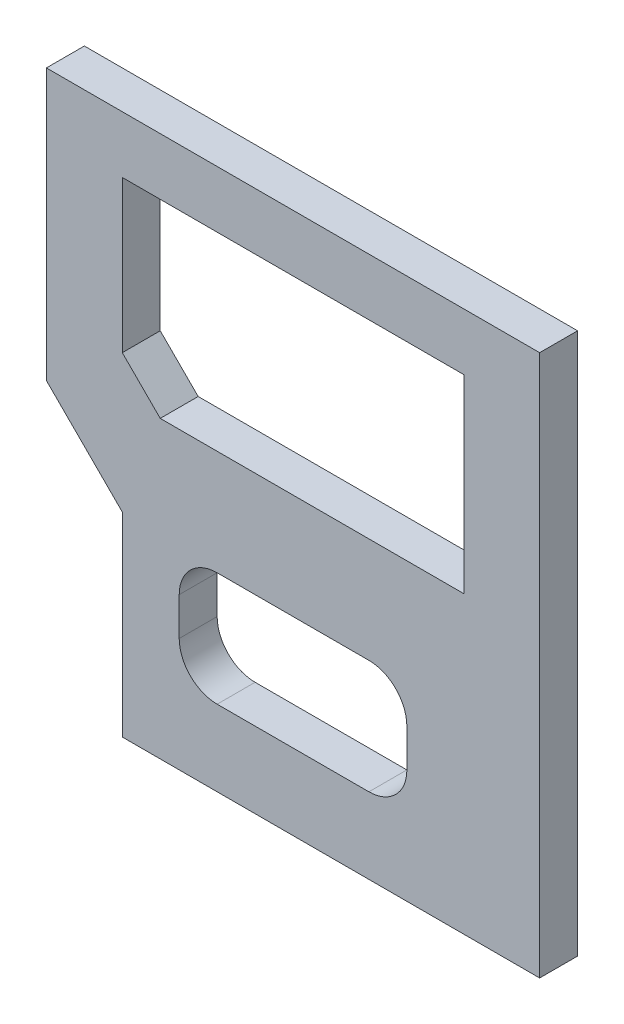
ISO-10303-21;
HEADER;
FILE_DESCRIPTION(('STEP AP214'),'2;1');
FILE_NAME('part.step','',(''),(''),'','','');
FILE_SCHEMA(('AUTOMOTIVE_DESIGN { 1 0 10303 214 1 1 1 1 }'));
ENDSEC;
DATA;
#1=APPLICATION_CONTEXT('core data for automotive mechanical design processes');
#2=APPLICATION_PROTOCOL_DEFINITION('international standard','automotive_design',2000,#1);
#3=PRODUCT_CONTEXT('',#1,'mechanical');
#4=PRODUCT('Part','Part','',(#3));
#5=PRODUCT_RELATED_PRODUCT_CATEGORY('part','',(#4));
#6=PRODUCT_DEFINITION_FORMATION('','',#4);
#7=PRODUCT_DEFINITION_CONTEXT('part definition',#1,'design');
#8=PRODUCT_DEFINITION('design','',#6,#7);
#9=PRODUCT_DEFINITION_SHAPE('','',#8);
#10=(LENGTH_UNIT() NAMED_UNIT(*) SI_UNIT(.MILLI.,.METRE.));
#11=(NAMED_UNIT(*) PLANE_ANGLE_UNIT() SI_UNIT($,.RADIAN.));
#12=(NAMED_UNIT(*) SI_UNIT($,.STERADIAN.) SOLID_ANGLE_UNIT());
#13=UNCERTAINTY_MEASURE_WITH_UNIT(LENGTH_MEASURE(1.E-05),#10,'distance_accuracy_value','');
#14=(GEOMETRIC_REPRESENTATION_CONTEXT(3) GLOBAL_UNCERTAINTY_ASSIGNED_CONTEXT((#13)) GLOBAL_UNIT_ASSIGNED_CONTEXT((#10,
#11,#12)) REPRESENTATION_CONTEXT('',''));
#15=CARTESIAN_POINT('',(0.,0.,0.));
#16=DIRECTION('',(0.,0.,1.));
#17=DIRECTION('',(1.,0.,0.));
#18=AXIS2_PLACEMENT_3D('',#15,#16,#17);
#19=CARTESIAN_POINT('',(0.,0.,10.));
#20=DIRECTION('',(0.,0.,-1.));
#21=DIRECTION('',(-1.,0.,0.));
#22=AXIS2_PLACEMENT_3D('',#19,#20,#21);
#23=PLANE('',#22);
#24=DIRECTION('',(0.,1.,0.));
#25=VECTOR('',#24,1.);
#26=CARTESIAN_POINT('',(45.,56.3669590643275,10.));
#27=LINE('',#26,#25);
#28=CARTESIAN_POINT('',(45.,6.36695906432746,10.));
#29=VERTEX_POINT('',#28);
#30=CARTESIAN_POINT('',(45.,56.3669590643275,10.));
#31=VERTEX_POINT('',#30);
#32=EDGE_CURVE('E232',#29,#31,#27,.T.);
#33=ORIENTED_EDGE('',*,*,#32,.F.);
#34=DIRECTION('',(1.,0.,0.));
#35=VECTOR('',#34,1.);
#36=CARTESIAN_POINT('',(45.,6.36695906432746,10.));
#37=LINE('',#36,#35);
#38=CARTESIAN_POINT('',(-35.,6.36695906432745,10.));
#39=VERTEX_POINT('',#38);
#40=EDGE_CURVE('E242',#39,#29,#37,.T.);
#41=ORIENTED_EDGE('',*,*,#40,.F.);
#42=DIRECTION('',(0.707106781186548,-0.707106781186547,0.));
#43=VECTOR('',#42,1.);
#44=CARTESIAN_POINT('',(-45.,16.3669590643274,10.));
#45=LINE('',#44,#43);
#46=CARTESIAN_POINT('',(-45.,16.3669590643274,10.));
#47=VERTEX_POINT('',#46);
#48=EDGE_CURVE('E239',#47,#39,#45,.T.);
#49=ORIENTED_EDGE('',*,*,#48,.F.);
#50=DIRECTION('',(0.,-1.,0.));
#51=VECTOR('',#50,1.);
#52=CARTESIAN_POINT('',(-45.,56.3669590643275,10.));
#53=LINE('',#52,#51);
#54=CARTESIAN_POINT('',(-45.,56.3669590643275,10.));
#55=VERTEX_POINT('',#54);
#56=EDGE_CURVE('E237',#55,#47,#53,.T.);
#57=ORIENTED_EDGE('',*,*,#56,.F.);
#58=DIRECTION('',(-1.,0.,0.));
#59=VECTOR('',#58,1.);
#60=CARTESIAN_POINT('',(45.,56.3669590643275,10.));
#61=LINE('',#60,#59);
#62=EDGE_CURVE('E234',#31,#55,#61,.T.);
#63=ORIENTED_EDGE('',*,*,#62,.F.);
#64=EDGE_LOOP('',(#33,#41,#49,#57,#63));
#65=FACE_BOUND('',#64,.T.);
#66=DIRECTION('',(0.,1.,0.));
#67=VECTOR('',#66,1.);
#68=CARTESIAN_POINT('',(65.,71.3669590643275,10.));
#69=LINE('',#68,#67);
#70=CARTESIAN_POINT('',(65.,-71.3669590643275,10.));
#71=VERTEX_POINT('',#70);
#72=CARTESIAN_POINT('',(65.,71.3669590643275,10.));
#73=VERTEX_POINT('',#72);
#74=EDGE_CURVE('E270',#71,#73,#69,.T.);
#75=ORIENTED_EDGE('',*,*,#74,.T.);
#76=DIRECTION('',(-1.,0.,0.));
#77=VECTOR('',#76,1.);
#78=CARTESIAN_POINT('',(65.,71.3669590643275,10.));
#79=LINE('',#78,#77);
#80=CARTESIAN_POINT('',(-65.,71.3669590643275,10.));
#81=VERTEX_POINT('',#80);
#82=EDGE_CURVE('E273',#73,#81,#79,.T.);
#83=ORIENTED_EDGE('',*,*,#82,.T.);
#84=DIRECTION('',(0.,-1.,0.));
#85=VECTOR('',#84,1.);
#86=CARTESIAN_POINT('',(-65.,71.3669590643275,10.));
#87=LINE('',#86,#85);
#88=CARTESIAN_POINT('',(-65.,0.,10.));
#89=VERTEX_POINT('',#88);
#90=EDGE_CURVE('E276',#81,#89,#87,.T.);
#91=ORIENTED_EDGE('',*,*,#90,.T.);
#92=DIRECTION('',(0.707106781186549,-0.707106781186546,0.));
#93=VECTOR('',#92,1.);
#94=CARTESIAN_POINT('',(-65.,0.,10.));
#95=LINE('',#94,#93);
#96=CARTESIAN_POINT('',(-45.,-19.9999999999999,10.));
#97=VERTEX_POINT('',#96);
#98=EDGE_CURVE('E278',#89,#97,#95,.T.);
#99=ORIENTED_EDGE('',*,*,#98,.T.);
#100=DIRECTION('',(0.,-1.,0.));
#101=VECTOR('',#100,1.);
#102=CARTESIAN_POINT('',(-45.,-19.9999999999999,10.));
#103=LINE('',#102,#101);
#104=CARTESIAN_POINT('',(-45.,-71.3669590643275,10.));
#105=VERTEX_POINT('',#104);
#106=EDGE_CURVE('E280',#97,#105,#103,.T.);
#107=ORIENTED_EDGE('',*,*,#106,.T.);
#108=DIRECTION('',(1.,0.,0.));
#109=VECTOR('',#108,1.);
#110=CARTESIAN_POINT('',(65.,-71.3669590643275,10.));
#111=LINE('',#110,#109);
#112=EDGE_CURVE('E282',#105,#71,#111,.T.);
#113=ORIENTED_EDGE('',*,*,#112,.T.);
#114=EDGE_LOOP('',(#75,#83,#91,#99,#107,#113));
#115=FACE_BOUND('',#114,.T.);
#116=CARTESIAN_POINT('',(-20.,-41.3669590643275,10.));
#117=DIRECTION('',(0.,0.,1.));
#118=DIRECTION('',(-1.,0.,0.));
#119=AXIS2_PLACEMENT_3D('',#116,#117,#118);
#120=CIRCLE('',#119,10.);
#121=CARTESIAN_POINT('',(-30.,-41.3669590643274,10.));
#122=VERTEX_POINT('',#121);
#123=CARTESIAN_POINT('',(-19.9999999999999,-51.3669590643275,10.));
#124=VERTEX_POINT('',#123);
#125=EDGE_CURVE('E167',#122,#124,#120,.T.);
#126=ORIENTED_EDGE('',*,*,#125,.F.);
#127=DIRECTION('',(0.,-1.,0.));
#128=VECTOR('',#127,1.);
#129=CARTESIAN_POINT('',(-30.,-31.3669590643275,10.));
#130=LINE('',#129,#128);
#131=CARTESIAN_POINT('',(-30.,-31.3669590643275,10.));
#132=VERTEX_POINT('',#131);
#133=EDGE_CURVE('E200',#132,#122,#130,.T.);
#134=ORIENTED_EDGE('',*,*,#133,.F.);
#135=CARTESIAN_POINT('',(-20.,-31.3669590643275,10.));
#136=DIRECTION('',(0.,0.,1.));
#137=DIRECTION('',(-1.,0.,0.));
#138=AXIS2_PLACEMENT_3D('',#135,#136,#137);
#139=CIRCLE('',#138,10.);
#140=CARTESIAN_POINT('',(-19.9999999999999,-21.3669590643275,10.));
#141=VERTEX_POINT('',#140);
#142=EDGE_CURVE('E198',#141,#132,#139,.T.);
#143=ORIENTED_EDGE('',*,*,#142,.F.);
#144=DIRECTION('',(-1.,0.,0.));
#145=VECTOR('',#144,1.);
#146=CARTESIAN_POINT('',(19.9999999999999,-21.3669590643275,10.));
#147=LINE('',#146,#145);
#148=CARTESIAN_POINT('',(19.9999999999999,-21.3669590643275,10.));
#149=VERTEX_POINT('',#148);
#150=EDGE_CURVE('E196',#149,#141,#147,.T.);
#151=ORIENTED_EDGE('',*,*,#150,.F.);
#152=CARTESIAN_POINT('',(20.,-31.3669590643275,10.));
#153=DIRECTION('',(0.,0.,1.));
#154=DIRECTION('',(1.,0.,0.));
#155=AXIS2_PLACEMENT_3D('',#152,#153,#154);
#156=CIRCLE('',#155,10.);
#157=CARTESIAN_POINT('',(30.,-31.3669590643275,10.));
#158=VERTEX_POINT('',#157);
#159=EDGE_CURVE('E194',#158,#149,#156,.T.);
#160=ORIENTED_EDGE('',*,*,#159,.F.);
#161=DIRECTION('',(0.,1.,0.));
#162=VECTOR('',#161,1.);
#163=CARTESIAN_POINT('',(30.,-31.3669590643275,10.));
#164=LINE('',#163,#162);
#165=CARTESIAN_POINT('',(30.,-41.3669590643274,10.));
#166=VERTEX_POINT('',#165);
#167=EDGE_CURVE('E190',#166,#158,#164,.T.);
#168=ORIENTED_EDGE('',*,*,#167,.F.);
#169=CARTESIAN_POINT('',(20.,-41.3669590643275,10.));
#170=DIRECTION('',(0.,0.,1.));
#171=DIRECTION('',(-1.,0.,0.));
#172=AXIS2_PLACEMENT_3D('',#169,#170,#171);
#173=CIRCLE('',#172,9.99999999999999);
#174=CARTESIAN_POINT('',(19.9999999999999,-51.3669590643275,10.));
#175=VERTEX_POINT('',#174);
#176=EDGE_CURVE('E188',#175,#166,#173,.T.);
#177=ORIENTED_EDGE('',*,*,#176,.F.);
#178=DIRECTION('',(1.,0.,0.));
#179=VECTOR('',#178,1.);
#180=CARTESIAN_POINT('',(19.9999999999999,-51.3669590643275,10.));
#181=LINE('',#180,#179);
#182=EDGE_CURVE('E175',#124,#175,#181,.T.);
#183=ORIENTED_EDGE('',*,*,#182,.F.);
#184=EDGE_LOOP('',(#126,#134,#143,#151,#160,#168,#177,#183));
#185=FACE_BOUND('',#184,.T.);
#186=ADVANCED_FACE('F36',(#65,#115,#185),#23,.F.);
#187=CARTESIAN_POINT('',(0.,0.,0.));
#188=DIRECTION('',(0.,0.,-1.));
#189=DIRECTION('',(-1.,0.,0.));
#190=AXIS2_PLACEMENT_3D('',#187,#188,#189);
#191=PLANE('',#190);
#192=DIRECTION('',(0.,1.,0.));
#193=VECTOR('',#192,1.);
#194=CARTESIAN_POINT('',(65.,71.3669590643275,0.));
#195=LINE('',#194,#193);
#196=CARTESIAN_POINT('',(65.,-71.3669590643275,0.));
#197=VERTEX_POINT('',#196);
#198=CARTESIAN_POINT('',(65.,71.3669590643275,0.));
#199=VERTEX_POINT('',#198);
#200=EDGE_CURVE('E269',#197,#199,#195,.T.);
#201=ORIENTED_EDGE('',*,*,#200,.F.);
#202=DIRECTION('',(1.,0.,0.));
#203=VECTOR('',#202,1.);
#204=CARTESIAN_POINT('',(65.,-71.3669590643275,0.));
#205=LINE('',#204,#203);
#206=CARTESIAN_POINT('',(-45.,-71.3669590643275,0.));
#207=VERTEX_POINT('',#206);
#208=EDGE_CURVE('E274',#207,#197,#205,.T.);
#209=ORIENTED_EDGE('',*,*,#208,.F.);
#210=DIRECTION('',(0.,-1.,0.));
#211=VECTOR('',#210,1.);
#212=CARTESIAN_POINT('',(-45.,-19.9999999999999,0.));
#213=LINE('',#212,#211);
#214=CARTESIAN_POINT('',(-45.,-19.9999999999999,0.));
#215=VERTEX_POINT('',#214);
#216=EDGE_CURVE('E293',#215,#207,#213,.T.);
#217=ORIENTED_EDGE('',*,*,#216,.F.);
#218=DIRECTION('',(0.707106781186549,-0.707106781186546,0.));
#219=VECTOR('',#218,1.);
#220=CARTESIAN_POINT('',(-65.,0.,0.));
#221=LINE('',#220,#219);
#222=CARTESIAN_POINT('',(-65.,0.,0.));
#223=VERTEX_POINT('',#222);
#224=EDGE_CURVE('E291',#223,#215,#221,.T.);
#225=ORIENTED_EDGE('',*,*,#224,.F.);
#226=DIRECTION('',(0.,-1.,0.));
#227=VECTOR('',#226,1.);
#228=CARTESIAN_POINT('',(-65.,71.3669590643275,0.));
#229=LINE('',#228,#227);
#230=CARTESIAN_POINT('',(-65.,71.3669590643275,0.));
#231=VERTEX_POINT('',#230);
#232=EDGE_CURVE('E289',#231,#223,#229,.T.);
#233=ORIENTED_EDGE('',*,*,#232,.F.);
#234=DIRECTION('',(-1.,0.,0.));
#235=VECTOR('',#234,1.);
#236=CARTESIAN_POINT('',(65.,71.3669590643275,0.));
#237=LINE('',#236,#235);
#238=EDGE_CURVE('E287',#199,#231,#237,.T.);
#239=ORIENTED_EDGE('',*,*,#238,.F.);
#240=EDGE_LOOP('',(#201,#209,#217,#225,#233,#239));
#241=FACE_BOUND('',#240,.T.);
#242=DIRECTION('',(1.,0.,0.));
#243=VECTOR('',#242,1.);
#244=CARTESIAN_POINT('',(45.,6.36695906432746,0.));
#245=LINE('',#244,#243);
#246=CARTESIAN_POINT('',(-35.,6.36695906432745,0.));
#247=VERTEX_POINT('',#246);
#248=CARTESIAN_POINT('',(45.,6.36695906432746,0.));
#249=VERTEX_POINT('',#248);
#250=EDGE_CURVE('E235',#247,#249,#245,.T.);
#251=ORIENTED_EDGE('',*,*,#250,.T.);
#252=DIRECTION('',(0.,1.,0.));
#253=VECTOR('',#252,1.);
#254=CARTESIAN_POINT('',(45.,56.3669590643275,0.));
#255=LINE('',#254,#253);
#256=CARTESIAN_POINT('',(45.,56.3669590643275,0.));
#257=VERTEX_POINT('',#256);
#258=EDGE_CURVE('E183',#249,#257,#255,.T.);
#259=ORIENTED_EDGE('',*,*,#258,.T.);
#260=DIRECTION('',(-1.,0.,0.));
#261=VECTOR('',#260,1.);
#262=CARTESIAN_POINT('',(45.,56.3669590643275,0.));
#263=LINE('',#262,#261);
#264=CARTESIAN_POINT('',(-45.,56.3669590643275,0.));
#265=VERTEX_POINT('',#264);
#266=EDGE_CURVE('E247',#257,#265,#263,.T.);
#267=ORIENTED_EDGE('',*,*,#266,.T.);
#268=DIRECTION('',(0.,-1.,0.));
#269=VECTOR('',#268,1.);
#270=CARTESIAN_POINT('',(-45.,56.3669590643275,0.));
#271=LINE('',#270,#269);
#272=CARTESIAN_POINT('',(-45.,16.3669590643274,0.));
#273=VERTEX_POINT('',#272);
#274=EDGE_CURVE('E250',#265,#273,#271,.T.);
#275=ORIENTED_EDGE('',*,*,#274,.T.);
#276=DIRECTION('',(0.707106781186548,-0.707106781186547,0.));
#277=VECTOR('',#276,1.);
#278=CARTESIAN_POINT('',(-45.,16.3669590643274,0.));
#279=LINE('',#278,#277);
#280=EDGE_CURVE('E253',#273,#247,#279,.T.);
#281=ORIENTED_EDGE('',*,*,#280,.T.);
#282=EDGE_LOOP('',(#251,#259,#267,#275,#281));
#283=FACE_BOUND('',#282,.T.);
#284=DIRECTION('',(0.,-1.,0.));
#285=VECTOR('',#284,1.);
#286=CARTESIAN_POINT('',(-30.,-31.3669590643275,0.));
#287=LINE('',#286,#285);
#288=CARTESIAN_POINT('',(-30.,-31.3669590643275,0.));
#289=VERTEX_POINT('',#288);
#290=CARTESIAN_POINT('',(-30.,-41.3669590643274,0.));
#291=VERTEX_POINT('',#290);
#292=EDGE_CURVE('E176',#289,#291,#287,.T.);
#293=ORIENTED_EDGE('',*,*,#292,.T.);
#294=CARTESIAN_POINT('',(-20.,-41.3669590643275,0.));
#295=DIRECTION('',(0.,0.,1.));
#296=DIRECTION('',(-1.,0.,0.));
#297=AXIS2_PLACEMENT_3D('',#294,#295,#296);
#298=CIRCLE('',#297,10.);
#299=CARTESIAN_POINT('',(-19.9999999999999,-51.3669590643275,0.));
#300=VERTEX_POINT('',#299);
#301=EDGE_CURVE('E59',#291,#300,#298,.T.);
#302=ORIENTED_EDGE('',*,*,#301,.T.);
#303=DIRECTION('',(1.,0.,0.));
#304=VECTOR('',#303,1.);
#305=CARTESIAN_POINT('',(19.9999999999999,-51.3669590643275,0.));
#306=LINE('',#305,#304);
#307=CARTESIAN_POINT('',(19.9999999999999,-51.3669590643275,0.));
#308=VERTEX_POINT('',#307);
#309=EDGE_CURVE('E182',#300,#308,#306,.T.);
#310=ORIENTED_EDGE('',*,*,#309,.T.);
#311=CARTESIAN_POINT('',(20.,-41.3669590643275,0.));
#312=DIRECTION('',(0.,0.,1.));
#313=DIRECTION('',(-1.,0.,0.));
#314=AXIS2_PLACEMENT_3D('',#311,#312,#313);
#315=CIRCLE('',#314,9.99999999999999);
#316=CARTESIAN_POINT('',(30.,-41.3669590643274,0.));
#317=VERTEX_POINT('',#316);
#318=EDGE_CURVE('E204',#308,#317,#315,.T.);
#319=ORIENTED_EDGE('',*,*,#318,.T.);
#320=DIRECTION('',(0.,1.,0.));
#321=VECTOR('',#320,1.);
#322=CARTESIAN_POINT('',(30.,-31.3669590643275,0.));
#323=LINE('',#322,#321);
#324=CARTESIAN_POINT('',(30.,-31.3669590643275,0.));
#325=VERTEX_POINT('',#324);
#326=EDGE_CURVE('E207',#317,#325,#323,.T.);
#327=ORIENTED_EDGE('',*,*,#326,.T.);
#328=CARTESIAN_POINT('',(20.,-31.3669590643275,0.));
#329=DIRECTION('',(0.,0.,1.));
#330=DIRECTION('',(1.,0.,0.));
#331=AXIS2_PLACEMENT_3D('',#328,#329,#330);
#332=CIRCLE('',#331,10.);
#333=CARTESIAN_POINT('',(19.9999999999999,-21.3669590643275,0.));
#334=VERTEX_POINT('',#333);
#335=EDGE_CURVE('E210',#325,#334,#332,.T.);
#336=ORIENTED_EDGE('',*,*,#335,.T.);
#337=DIRECTION('',(-1.,0.,0.));
#338=VECTOR('',#337,1.);
#339=CARTESIAN_POINT('',(19.9999999999999,-21.3669590643275,0.));
#340=LINE('',#339,#338);
#341=CARTESIAN_POINT('',(-19.9999999999999,-21.3669590643275,0.));
#342=VERTEX_POINT('',#341);
#343=EDGE_CURVE('E213',#334,#342,#340,.T.);
#344=ORIENTED_EDGE('',*,*,#343,.T.);
#345=CARTESIAN_POINT('',(-20.,-31.3669590643275,0.));
#346=DIRECTION('',(0.,0.,1.));
#347=DIRECTION('',(-1.,0.,0.));
#348=AXIS2_PLACEMENT_3D('',#345,#346,#347);
#349=CIRCLE('',#348,10.);
#350=EDGE_CURVE('E216',#342,#289,#349,.T.);
#351=ORIENTED_EDGE('',*,*,#350,.T.);
#352=EDGE_LOOP('',(#293,#302,#310,#319,#327,#336,#344,#351));
#353=FACE_BOUND('',#352,.T.);
#354=ADVANCED_FACE('F317',(#241,#283,#353),#191,.T.);
#355=CARTESIAN_POINT('',(65.,71.3669590643275,10.));
#356=DIRECTION('',(-1.,0.,0.));
#357=DIRECTION('',(0.,0.,1.));
#358=AXIS2_PLACEMENT_3D('',#355,#356,#357);
#359=PLANE('',#358);
#360=ORIENTED_EDGE('',*,*,#200,.T.);
#361=DIRECTION('',(0.,0.,-1.));
#362=VECTOR('',#361,1.);
#363=CARTESIAN_POINT('',(65.,71.3669590643275,10.));
#364=LINE('',#363,#362);
#365=EDGE_CURVE('E11',#73,#199,#364,.T.);
#366=ORIENTED_EDGE('',*,*,#365,.F.);
#367=ORIENTED_EDGE('',*,*,#74,.F.);
#368=DIRECTION('',(0.,0.,-1.));
#369=VECTOR('',#368,1.);
#370=CARTESIAN_POINT('',(65.,-71.3669590643275,10.));
#371=LINE('',#370,#369);
#372=EDGE_CURVE('E284',#71,#197,#371,.T.);
#373=ORIENTED_EDGE('',*,*,#372,.T.);
#374=EDGE_LOOP('',(#360,#366,#367,#373));
#375=FACE_BOUND('',#374,.T.);
#376=ADVANCED_FACE('F38',(#375),#359,.F.);
#377=CARTESIAN_POINT('',(65.,71.3669590643275,10.));
#378=DIRECTION('',(0.,-1.,0.));
#379=DIRECTION('',(0.,0.,-1.));
#380=AXIS2_PLACEMENT_3D('',#377,#378,#379);
#381=PLANE('',#380);
#382=ORIENTED_EDGE('',*,*,#238,.T.);
#383=DIRECTION('',(0.,0.,-1.));
#384=VECTOR('',#383,1.);
#385=CARTESIAN_POINT('',(-65.,71.3669590643275,10.));
#386=LINE('',#385,#384);
#387=EDGE_CURVE('E44',#81,#231,#386,.T.);
#388=ORIENTED_EDGE('',*,*,#387,.F.);
#389=ORIENTED_EDGE('',*,*,#82,.F.);
#390=ORIENTED_EDGE('',*,*,#365,.T.);
#391=EDGE_LOOP('',(#382,#388,#389,#390));
#392=FACE_BOUND('',#391,.T.);
#393=ADVANCED_FACE('F334',(#392),#381,.F.);
#394=CARTESIAN_POINT('',(-65.,71.3669590643275,10.));
#395=DIRECTION('',(1.,0.,0.));
#396=DIRECTION('',(0.,0.,-1.));
#397=AXIS2_PLACEMENT_3D('',#394,#395,#396);
#398=PLANE('',#397);
#399=ORIENTED_EDGE('',*,*,#232,.T.);
#400=DIRECTION('',(0.,0.,-1.));
#401=VECTOR('',#400,1.);
#402=CARTESIAN_POINT('',(-65.,0.,10.));
#403=LINE('',#402,#401);
#404=EDGE_CURVE('E304',#89,#223,#403,.T.);
#405=ORIENTED_EDGE('',*,*,#404,.F.);
#406=ORIENTED_EDGE('',*,*,#90,.F.);
#407=ORIENTED_EDGE('',*,*,#387,.T.);
#408=EDGE_LOOP('',(#399,#405,#406,#407));
#409=FACE_BOUND('',#408,.T.);
#410=ADVANCED_FACE('F311',(#409),#398,.F.);
#411=CARTESIAN_POINT('',(-65.,0.,10.));
#412=DIRECTION('',(0.707106781186546,0.707106781186549,0.));
#413=DIRECTION('',(-0.707106781186549,0.707106781186546,0.));
#414=AXIS2_PLACEMENT_3D('',#411,#412,#413);
#415=PLANE('',#414);
#416=ORIENTED_EDGE('',*,*,#224,.T.);
#417=DIRECTION('',(0.,0.,-1.));
#418=VECTOR('',#417,1.);
#419=CARTESIAN_POINT('',(-45.,-19.9999999999999,10.));
#420=LINE('',#419,#418);
#421=EDGE_CURVE('E301',#97,#215,#420,.T.);
#422=ORIENTED_EDGE('',*,*,#421,.F.);
#423=ORIENTED_EDGE('',*,*,#98,.F.);
#424=ORIENTED_EDGE('',*,*,#404,.T.);
#425=EDGE_LOOP('',(#416,#422,#423,#424));
#426=FACE_BOUND('',#425,.T.);
#427=ADVANCED_FACE('F323',(#426),#415,.F.);
#428=CARTESIAN_POINT('',(-45.,-19.9999999999999,10.));
#429=DIRECTION('',(1.,0.,0.));
#430=DIRECTION('',(0.,1.,0.));
#431=AXIS2_PLACEMENT_3D('',#428,#429,#430);
#432=PLANE('',#431);
#433=ORIENTED_EDGE('',*,*,#216,.T.);
#434=DIRECTION('',(0.,0.,-1.));
#435=VECTOR('',#434,1.);
#436=CARTESIAN_POINT('',(-45.,-71.3669590643275,10.));
#437=LINE('',#436,#435);
#438=EDGE_CURVE('E298',#105,#207,#437,.T.);
#439=ORIENTED_EDGE('',*,*,#438,.F.);
#440=ORIENTED_EDGE('',*,*,#106,.F.);
#441=ORIENTED_EDGE('',*,*,#421,.T.);
#442=EDGE_LOOP('',(#433,#439,#440,#441));
#443=FACE_BOUND('',#442,.T.);
#444=ADVANCED_FACE('F327',(#443),#432,.F.);
#445=CARTESIAN_POINT('',(65.,-71.3669590643275,10.));
#446=DIRECTION('',(0.,1.,0.));
#447=DIRECTION('',(0.,0.,1.));
#448=AXIS2_PLACEMENT_3D('',#445,#446,#447);
#449=PLANE('',#448);
#450=ORIENTED_EDGE('',*,*,#208,.T.);
#451=ORIENTED_EDGE('',*,*,#372,.F.);
#452=ORIENTED_EDGE('',*,*,#112,.F.);
#453=ORIENTED_EDGE('',*,*,#438,.T.);
#454=EDGE_LOOP('',(#450,#451,#452,#453));
#455=FACE_BOUND('',#454,.T.);
#456=ADVANCED_FACE('F337',(#455),#449,.F.);
#457=CARTESIAN_POINT('',(45.,56.3669590643275,10.));
#458=DIRECTION('',(-1.,0.,0.));
#459=DIRECTION('',(0.,-1.,0.));
#460=AXIS2_PLACEMENT_3D('',#457,#458,#459);
#461=PLANE('',#460);
#462=ORIENTED_EDGE('',*,*,#258,.F.);
#463=DIRECTION('',(0.,0.,-1.));
#464=VECTOR('',#463,1.);
#465=CARTESIAN_POINT('',(45.,6.36695906432746,10.));
#466=LINE('',#465,#464);
#467=EDGE_CURVE('E244',#29,#249,#466,.T.);
#468=ORIENTED_EDGE('',*,*,#467,.F.);
#469=ORIENTED_EDGE('',*,*,#32,.T.);
#470=DIRECTION('',(0.,0.,-1.));
#471=VECTOR('',#470,1.);
#472=CARTESIAN_POINT('',(45.,56.3669590643275,10.));
#473=LINE('',#472,#471);
#474=EDGE_CURVE('E266',#31,#257,#473,.T.);
#475=ORIENTED_EDGE('',*,*,#474,.T.);
#476=EDGE_LOOP('',(#462,#468,#469,#475));
#477=FACE_BOUND('',#476,.T.);
#478=ADVANCED_FACE('F339',(#477),#461,.T.);
#479=CARTESIAN_POINT('',(45.,56.3669590643275,10.));
#480=DIRECTION('',(0.,-1.,0.));
#481=DIRECTION('',(1.,0.,0.));
#482=AXIS2_PLACEMENT_3D('',#479,#480,#481);
#483=PLANE('',#482);
#484=ORIENTED_EDGE('',*,*,#266,.F.);
#485=ORIENTED_EDGE('',*,*,#474,.F.);
#486=ORIENTED_EDGE('',*,*,#62,.T.);
#487=DIRECTION('',(0.,0.,-1.));
#488=VECTOR('',#487,1.);
#489=CARTESIAN_POINT('',(-45.,56.3669590643275,10.));
#490=LINE('',#489,#488);
#491=EDGE_CURVE('E264',#55,#265,#490,.T.);
#492=ORIENTED_EDGE('',*,*,#491,.T.);
#493=EDGE_LOOP('',(#484,#485,#486,#492));
#494=FACE_BOUND('',#493,.T.);
#495=ADVANCED_FACE('F345',(#494),#483,.T.);
#496=CARTESIAN_POINT('',(-45.,56.3669590643275,10.));
#497=DIRECTION('',(1.,0.,0.));
#498=DIRECTION('',(0.,1.,0.));
#499=AXIS2_PLACEMENT_3D('',#496,#497,#498);
#500=PLANE('',#499);
#501=ORIENTED_EDGE('',*,*,#274,.F.);
#502=ORIENTED_EDGE('',*,*,#491,.F.);
#503=ORIENTED_EDGE('',*,*,#56,.T.);
#504=DIRECTION('',(0.,0.,-1.));
#505=VECTOR('',#504,1.);
#506=CARTESIAN_POINT('',(-45.,16.3669590643274,10.));
#507=LINE('',#506,#505);
#508=EDGE_CURVE('E262',#47,#273,#507,.T.);
#509=ORIENTED_EDGE('',*,*,#508,.T.);
#510=EDGE_LOOP('',(#501,#502,#503,#509));
#511=FACE_BOUND('',#510,.T.);
#512=ADVANCED_FACE('F360',(#511),#500,.T.);
#513=CARTESIAN_POINT('',(-45.,16.3669590643274,10.));
#514=DIRECTION('',(0.707106781186547,0.707106781186548,0.));
#515=DIRECTION('',(-0.707106781186548,0.707106781186547,0.));
#516=AXIS2_PLACEMENT_3D('',#513,#514,#515);
#517=PLANE('',#516);
#518=ORIENTED_EDGE('',*,*,#280,.F.);
#519=ORIENTED_EDGE('',*,*,#508,.F.);
#520=ORIENTED_EDGE('',*,*,#48,.T.);
#521=DIRECTION('',(0.,0.,-1.));
#522=VECTOR('',#521,1.);
#523=CARTESIAN_POINT('',(-35.,6.36695906432745,10.));
#524=LINE('',#523,#522);
#525=EDGE_CURVE('E260',#39,#247,#524,.T.);
#526=ORIENTED_EDGE('',*,*,#525,.T.);
#527=EDGE_LOOP('',(#518,#519,#520,#526));
#528=FACE_BOUND('',#527,.T.);
#529=ADVANCED_FACE('F364',(#528),#517,.T.);
#530=CARTESIAN_POINT('',(45.,6.36695906432746,10.));
#531=DIRECTION('',(0.,1.,0.));
#532=DIRECTION('',(-1.,0.,0.));
#533=AXIS2_PLACEMENT_3D('',#530,#531,#532);
#534=PLANE('',#533);
#535=ORIENTED_EDGE('',*,*,#250,.F.);
#536=ORIENTED_EDGE('',*,*,#525,.F.);
#537=ORIENTED_EDGE('',*,*,#40,.T.);
#538=ORIENTED_EDGE('',*,*,#467,.T.);
#539=EDGE_LOOP('',(#535,#536,#537,#538));
#540=FACE_BOUND('',#539,.T.);
#541=ADVANCED_FACE('F368',(#540),#534,.T.);
#542=CARTESIAN_POINT('',(-20.,-41.3669590643275,10.));
#543=DIRECTION('',(0.,0.,-1.));
#544=DIRECTION('',(-1.,0.,0.));
#545=AXIS2_PLACEMENT_3D('',#542,#543,#544);
#546=CYLINDRICAL_SURFACE('',#545,10.);
#547=ORIENTED_EDGE('',*,*,#301,.F.);
#548=DIRECTION('',(0.,0.,-1.));
#549=VECTOR('',#548,1.);
#550=CARTESIAN_POINT('',(-30.,-41.3669590643274,10.));
#551=LINE('',#550,#549);
#552=EDGE_CURVE('E171',#122,#291,#551,.T.);
#553=ORIENTED_EDGE('',*,*,#552,.F.);
#554=ORIENTED_EDGE('',*,*,#125,.T.);
#555=DIRECTION('',(0.,0.,-1.));
#556=VECTOR('',#555,1.);
#557=CARTESIAN_POINT('',(-19.9999999999999,-51.3669590643275,10.));
#558=LINE('',#557,#556);
#559=EDGE_CURVE('E170',#124,#300,#558,.T.);
#560=ORIENTED_EDGE('',*,*,#559,.T.);
#561=EDGE_LOOP('',(#547,#553,#554,#560));
#562=FACE_BOUND('',#561,.T.);
#563=ADVANCED_FACE('F169',(#562),#546,.F.);
#564=CARTESIAN_POINT('',(19.9999999999999,-51.3669590643275,10.));
#565=DIRECTION('',(0.,1.,0.));
#566=DIRECTION('',(-1.,0.,0.));
#567=AXIS2_PLACEMENT_3D('',#564,#565,#566);
#568=PLANE('',#567);
#569=ORIENTED_EDGE('',*,*,#309,.F.);
#570=ORIENTED_EDGE('',*,*,#559,.F.);
#571=ORIENTED_EDGE('',*,*,#182,.T.);
#572=DIRECTION('',(0.,0.,-1.));
#573=VECTOR('',#572,1.);
#574=CARTESIAN_POINT('',(19.9999999999999,-51.3669590643275,10.));
#575=LINE('',#574,#573);
#576=EDGE_CURVE('E184',#175,#308,#575,.T.);
#577=ORIENTED_EDGE('',*,*,#576,.T.);
#578=EDGE_LOOP('',(#569,#570,#571,#577));
#579=FACE_BOUND('',#578,.T.);
#580=ADVANCED_FACE('F179',(#579),#568,.T.);
#581=CARTESIAN_POINT('',(20.,-41.3669590643275,10.));
#582=DIRECTION('',(0.,0.,-1.));
#583=DIRECTION('',(-1.,0.,0.));
#584=AXIS2_PLACEMENT_3D('',#581,#582,#583);
#585=CYLINDRICAL_SURFACE('',#584,9.99999999999999);
#586=ORIENTED_EDGE('',*,*,#318,.F.);
#587=ORIENTED_EDGE('',*,*,#576,.F.);
#588=ORIENTED_EDGE('',*,*,#176,.T.);
#589=DIRECTION('',(0.,0.,-1.));
#590=VECTOR('',#589,1.);
#591=CARTESIAN_POINT('',(30.,-41.3669590643274,10.));
#592=LINE('',#591,#590);
#593=EDGE_CURVE('E229',#166,#317,#592,.T.);
#594=ORIENTED_EDGE('',*,*,#593,.T.);
#595=EDGE_LOOP('',(#586,#587,#588,#594));
#596=FACE_BOUND('',#595,.T.);
#597=ADVANCED_FACE('F377',(#596),#585,.F.);
#598=CARTESIAN_POINT('',(30.,-31.3669590643275,10.));
#599=DIRECTION('',(-1.,0.,0.));
#600=DIRECTION('',(0.,0.,1.));
#601=AXIS2_PLACEMENT_3D('',#598,#599,#600);
#602=PLANE('',#601);
#603=ORIENTED_EDGE('',*,*,#326,.F.);
#604=ORIENTED_EDGE('',*,*,#593,.F.);
#605=ORIENTED_EDGE('',*,*,#167,.T.);
#606=DIRECTION('',(0.,0.,-1.));
#607=VECTOR('',#606,1.);
#608=CARTESIAN_POINT('',(30.,-31.3669590643275,10.));
#609=LINE('',#608,#607);
#610=EDGE_CURVE('E227',#158,#325,#609,.T.);
#611=ORIENTED_EDGE('',*,*,#610,.T.);
#612=EDGE_LOOP('',(#603,#604,#605,#611));
#613=FACE_BOUND('',#612,.T.);
#614=ADVANCED_FACE('F380',(#613),#602,.T.);
#615=CARTESIAN_POINT('',(20.,-31.3669590643275,10.));
#616=DIRECTION('',(0.,0.,-1.));
#617=DIRECTION('',(-1.,0.,0.));
#618=AXIS2_PLACEMENT_3D('',#615,#616,#617);
#619=CYLINDRICAL_SURFACE('',#618,10.);
#620=ORIENTED_EDGE('',*,*,#335,.F.);
#621=ORIENTED_EDGE('',*,*,#610,.F.);
#622=ORIENTED_EDGE('',*,*,#159,.T.);
#623=DIRECTION('',(0.,0.,-1.));
#624=VECTOR('',#623,1.);
#625=CARTESIAN_POINT('',(19.9999999999999,-21.3669590643275,10.));
#626=LINE('',#625,#624);
#627=EDGE_CURVE('E225',#149,#334,#626,.T.);
#628=ORIENTED_EDGE('',*,*,#627,.T.);
#629=EDGE_LOOP('',(#620,#621,#622,#628));
#630=FACE_BOUND('',#629,.T.);
#631=ADVANCED_FACE('F384',(#630),#619,.F.);
#632=CARTESIAN_POINT('',(19.9999999999999,-21.3669590643275,10.));
#633=DIRECTION('',(0.,-1.,0.));
#634=DIRECTION('',(1.,0.,0.));
#635=AXIS2_PLACEMENT_3D('',#632,#633,#634);
#636=PLANE('',#635);
#637=ORIENTED_EDGE('',*,*,#343,.F.);
#638=ORIENTED_EDGE('',*,*,#627,.F.);
#639=ORIENTED_EDGE('',*,*,#150,.T.);
#640=DIRECTION('',(0.,0.,-1.));
#641=VECTOR('',#640,1.);
#642=CARTESIAN_POINT('',(-19.9999999999999,-21.3669590643275,10.));
#643=LINE('',#642,#641);
#644=EDGE_CURVE('E223',#141,#342,#643,.T.);
#645=ORIENTED_EDGE('',*,*,#644,.T.);
#646=EDGE_LOOP('',(#637,#638,#639,#645));
#647=FACE_BOUND('',#646,.T.);
#648=ADVANCED_FACE('F388',(#647),#636,.T.);
#649=CARTESIAN_POINT('',(-20.,-31.3669590643275,10.));
#650=DIRECTION('',(0.,0.,-1.));
#651=DIRECTION('',(-1.,0.,0.));
#652=AXIS2_PLACEMENT_3D('',#649,#650,#651);
#653=CYLINDRICAL_SURFACE('',#652,10.);
#654=ORIENTED_EDGE('',*,*,#350,.F.);
#655=ORIENTED_EDGE('',*,*,#644,.F.);
#656=ORIENTED_EDGE('',*,*,#142,.T.);
#657=DIRECTION('',(0.,0.,-1.));
#658=VECTOR('',#657,1.);
#659=CARTESIAN_POINT('',(-30.,-31.3669590643275,10.));
#660=LINE('',#659,#658);
#661=EDGE_CURVE('E51',#132,#289,#660,.T.);
#662=ORIENTED_EDGE('',*,*,#661,.T.);
#663=EDGE_LOOP('',(#654,#655,#656,#662));
#664=FACE_BOUND('',#663,.T.);
#665=ADVANCED_FACE('F392',(#664),#653,.F.);
#666=CARTESIAN_POINT('',(-30.,-31.3669590643275,10.));
#667=DIRECTION('',(1.,0.,0.));
#668=DIRECTION('',(0.,0.,-1.));
#669=AXIS2_PLACEMENT_3D('',#666,#667,#668);
#670=PLANE('',#669);
#671=ORIENTED_EDGE('',*,*,#292,.F.);
#672=ORIENTED_EDGE('',*,*,#661,.F.);
#673=ORIENTED_EDGE('',*,*,#133,.T.);
#674=ORIENTED_EDGE('',*,*,#552,.T.);
#675=EDGE_LOOP('',(#671,#672,#673,#674));
#676=FACE_BOUND('',#675,.T.);
#677=ADVANCED_FACE('F396',(#676),#670,.T.);
#678=CLOSED_SHELL('',(#186,#354,#376,#393,#410,#427,#444,#456,#478,#495,#512,#529,#541,#563,
#580,#597,#614,#631,#648,#665,#677));
#679=MANIFOLD_SOLID_BREP('B2',#678);
#680=ADVANCED_BREP_SHAPE_REPRESENTATION('',(#18,#679),#14);
#681=SHAPE_DEFINITION_REPRESENTATION(#9,#680);
ENDSEC;
END-ISO-10303-21;
